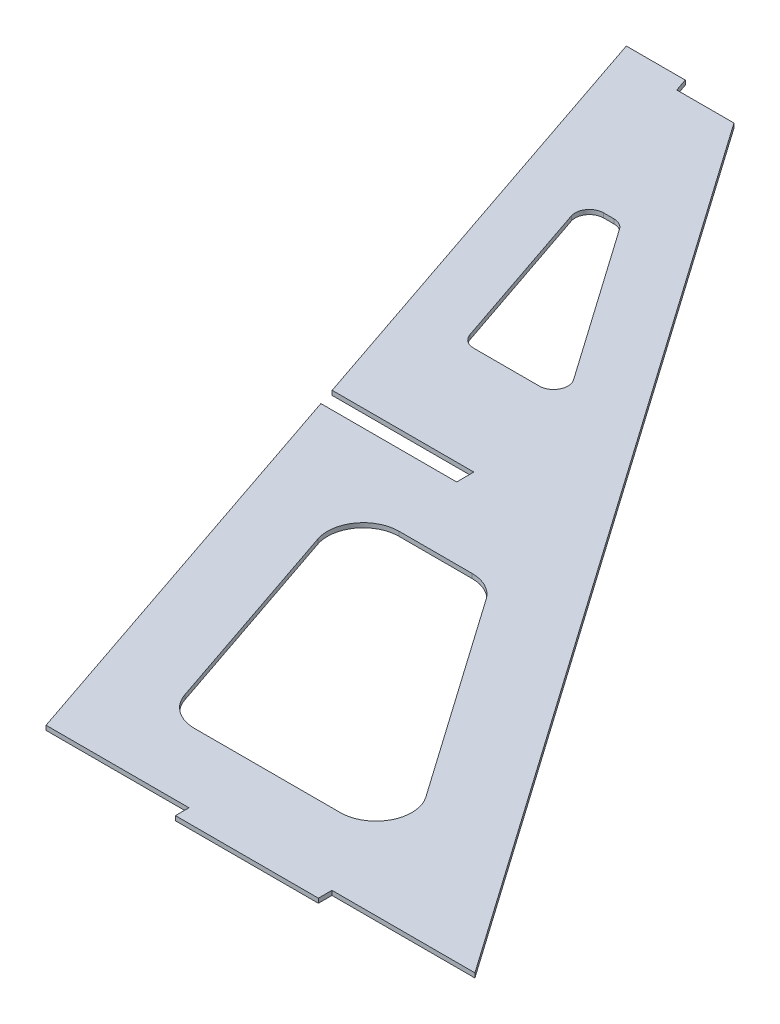
ISO-10303-21;
HEADER;
FILE_DESCRIPTION(('STEP AP214'),'2;1');
FILE_NAME('part.step','',(''),(''),'','','');
FILE_SCHEMA(('AUTOMOTIVE_DESIGN { 1 0 10303 214 1 1 1 1 }'));
ENDSEC;
DATA;
#1=APPLICATION_CONTEXT('core data for automotive mechanical design processes');
#2=APPLICATION_PROTOCOL_DEFINITION('international standard','automotive_design',2000,#1);
#3=PRODUCT_CONTEXT('',#1,'mechanical');
#4=PRODUCT('Part','Part','',(#3));
#5=PRODUCT_RELATED_PRODUCT_CATEGORY('part','',(#4));
#6=PRODUCT_DEFINITION_FORMATION('','',#4);
#7=PRODUCT_DEFINITION_CONTEXT('part definition',#1,'design');
#8=PRODUCT_DEFINITION('design','',#6,#7);
#9=PRODUCT_DEFINITION_SHAPE('','',#8);
#10=(LENGTH_UNIT() NAMED_UNIT(*) SI_UNIT(.MILLI.,.METRE.));
#11=(NAMED_UNIT(*) PLANE_ANGLE_UNIT() SI_UNIT($,.RADIAN.));
#12=(NAMED_UNIT(*) SI_UNIT($,.STERADIAN.) SOLID_ANGLE_UNIT());
#13=UNCERTAINTY_MEASURE_WITH_UNIT(LENGTH_MEASURE(1.E-05),#10,'distance_accuracy_value','');
#14=(GEOMETRIC_REPRESENTATION_CONTEXT(3) GLOBAL_UNCERTAINTY_ASSIGNED_CONTEXT((#13)) GLOBAL_UNIT_ASSIGNED_CONTEXT((#10,
#11,#12)) REPRESENTATION_CONTEXT('',''));
#15=CARTESIAN_POINT('',(0.,0.,0.));
#16=DIRECTION('',(0.,0.,1.));
#17=DIRECTION('',(1.,0.,0.));
#18=AXIS2_PLACEMENT_3D('',#15,#16,#17);
#19=CARTESIAN_POINT('',(-101.6,1.5875,-4.82599999999999));
#20=DIRECTION('',(0.946947902183429,0.,-0.321387103895603));
#21=DIRECTION('',(-0.321387103895603,0.,-0.946947902183429));
#22=AXIS2_PLACEMENT_3D('',#19,#20,#21);
#23=PLANE('',#22);
#24=DIRECTION('',(0.321387103895603,0.,0.946947902183429));
#25=VECTOR('',#24,1.);
#26=CARTESIAN_POINT('',(-101.6,1.5875,-4.82599999999999));
#27=LINE('',#26,#25);
#28=CARTESIAN_POINT('',(-151.771728228272,1.5875,-152.654));
#29=VERTEX_POINT('',#28);
#30=CARTESIAN_POINT('',(-101.6,1.5875,-4.82599999999999));
#31=VERTEX_POINT('',#30);
#32=EDGE_CURVE('E277',#29,#31,#27,.T.);
#33=ORIENTED_EDGE('',*,*,#32,.F.);
#34=DIRECTION('',(0.,1.,0.));
#35=VECTOR('',#34,1.);
#36=CARTESIAN_POINT('',(-151.771728228272,0.,-152.654));
#37=LINE('',#36,#35);
#38=CARTESIAN_POINT('',(-151.771728228272,0.,-152.654));
#39=VERTEX_POINT('',#38);
#40=EDGE_CURVE('E267',#39,#29,#37,.T.);
#41=ORIENTED_EDGE('',*,*,#40,.F.);
#42=DIRECTION('',(0.321387103895603,0.,0.946947902183429));
#43=VECTOR('',#42,1.);
#44=CARTESIAN_POINT('',(-101.6,0.,-4.82599999999999));
#45=LINE('',#44,#43);
#46=CARTESIAN_POINT('',(-101.6,0.,-4.82599999999999));
#47=VERTEX_POINT('',#46);
#48=EDGE_CURVE('E254',#39,#47,#45,.T.);
#49=ORIENTED_EDGE('',*,*,#48,.T.);
#50=DIRECTION('',(0.,-1.,0.));
#51=VECTOR('',#50,1.);
#52=CARTESIAN_POINT('',(-101.6,1.5875,-4.82599999999999));
#53=LINE('',#52,#51);
#54=EDGE_CURVE('E343',#31,#47,#53,.T.);
#55=ORIENTED_EDGE('',*,*,#54,.F.);
#56=EDGE_LOOP('',(#33,#41,#49,#55));
#57=FACE_BOUND('',#56,.T.);
#58=ADVANCED_FACE('F33',(#57),#23,.F.);
#59=CARTESIAN_POINT('',(-207.536668490646,0.,-316.962065123836));
#60=VERTEX_POINT('',#59);
#61=CARTESIAN_POINT('',(-153.840665474799,0.,-158.75));
#62=VERTEX_POINT('',#61);
#63=EDGE_CURVE('E296',#60,#62,#45,.T.);
#64=ORIENTED_EDGE('',*,*,#63,.T.);
#65=DIRECTION('',(0.,1.,0.));
#66=VECTOR('',#65,1.);
#67=CARTESIAN_POINT('',(-153.840665474799,0.,-158.75));
#68=LINE('',#67,#66);
#69=CARTESIAN_POINT('',(-153.840665474799,1.5875,-158.75));
#70=VERTEX_POINT('',#69);
#71=EDGE_CURVE('E269',#62,#70,#68,.T.);
#72=ORIENTED_EDGE('',*,*,#71,.T.);
#73=CARTESIAN_POINT('',(-207.536668490646,1.5875,-316.962065123836));
#74=VERTEX_POINT('',#73);
#75=EDGE_CURVE('E273',#74,#70,#27,.T.);
#76=ORIENTED_EDGE('',*,*,#75,.F.);
#77=DIRECTION('',(0.,-1.,0.));
#78=VECTOR('',#77,1.);
#79=CARTESIAN_POINT('',(-207.536668490646,1.5875,-316.962065123836));
#80=LINE('',#79,#78);
#81=EDGE_CURVE('E295',#74,#60,#80,.T.);
#82=ORIENTED_EDGE('',*,*,#81,.T.);
#83=EDGE_LOOP('',(#64,#72,#76,#82));
#84=FACE_BOUND('',#83,.T.);
#85=ADVANCED_FACE('F467',(#84),#23,.F.);
#86=CARTESIAN_POINT('',(-50.8,1.5875,-4.82599999999999));
#87=DIRECTION('',(0.,0.,-1.));
#88=DIRECTION('',(-1.,0.,0.));
#89=AXIS2_PLACEMENT_3D('',#86,#87,#88);
#90=PLANE('',#89);
#91=DIRECTION('',(1.,0.,0.));
#92=VECTOR('',#91,1.);
#93=CARTESIAN_POINT('',(-50.8,0.,-4.82599999999999));
#94=LINE('',#93,#92);
#95=CARTESIAN_POINT('',(-50.8,0.,-4.82599999999999));
#96=VERTEX_POINT('',#95);
#97=EDGE_CURVE('E299',#47,#96,#94,.T.);
#98=ORIENTED_EDGE('',*,*,#97,.T.);
#99=DIRECTION('',(0.,-1.,0.));
#100=VECTOR('',#99,1.);
#101=CARTESIAN_POINT('',(-50.8,1.5875,-4.82599999999999));
#102=LINE('',#101,#100);
#103=CARTESIAN_POINT('',(-50.8,1.5875,-4.82599999999999));
#104=VERTEX_POINT('',#103);
#105=EDGE_CURVE('E340',#104,#96,#102,.T.);
#106=ORIENTED_EDGE('',*,*,#105,.F.);
#107=DIRECTION('',(1.,0.,0.));
#108=VECTOR('',#107,1.);
#109=CARTESIAN_POINT('',(-50.8,1.5875,-4.82599999999999));
#110=LINE('',#109,#108);
#111=EDGE_CURVE('E276',#31,#104,#110,.T.);
#112=ORIENTED_EDGE('',*,*,#111,.F.);
#113=ORIENTED_EDGE('',*,*,#54,.T.);
#114=EDGE_LOOP('',(#98,#106,#112,#113));
#115=FACE_BOUND('',#114,.T.);
#116=ADVANCED_FACE('F473',(#115),#90,.F.);
#117=CARTESIAN_POINT('',(-50.8,1.5875,0.));
#118=DIRECTION('',(1.,0.,0.));
#119=DIRECTION('',(0.,0.,-1.));
#120=AXIS2_PLACEMENT_3D('',#117,#118,#119);
#121=PLANE('',#120);
#122=DIRECTION('',(0.,0.,1.));
#123=VECTOR('',#122,1.);
#124=CARTESIAN_POINT('',(-50.8,0.,0.));
#125=LINE('',#124,#123);
#126=CARTESIAN_POINT('',(-50.8,0.,0.));
#127=VERTEX_POINT('',#126);
#128=EDGE_CURVE('E301',#96,#127,#125,.T.);
#129=ORIENTED_EDGE('',*,*,#128,.T.);
#130=DIRECTION('',(0.,-1.,0.));
#131=VECTOR('',#130,1.);
#132=CARTESIAN_POINT('',(-50.8,1.5875,0.));
#133=LINE('',#132,#131);
#134=CARTESIAN_POINT('',(-50.8,1.5875,0.));
#135=VERTEX_POINT('',#134);
#136=EDGE_CURVE('E337',#135,#127,#133,.T.);
#137=ORIENTED_EDGE('',*,*,#136,.F.);
#138=DIRECTION('',(0.,0.,1.));
#139=VECTOR('',#138,1.);
#140=CARTESIAN_POINT('',(-50.8,1.5875,0.));
#141=LINE('',#140,#139);
#142=EDGE_CURVE('E279',#104,#135,#141,.T.);
#143=ORIENTED_EDGE('',*,*,#142,.F.);
#144=ORIENTED_EDGE('',*,*,#105,.T.);
#145=EDGE_LOOP('',(#129,#137,#143,#144));
#146=FACE_BOUND('',#145,.T.);
#147=ADVANCED_FACE('F557',(#146),#121,.F.);
#148=CARTESIAN_POINT('',(0.,1.5875,0.));
#149=DIRECTION('',(0.,0.,-1.));
#150=DIRECTION('',(-1.,0.,0.));
#151=AXIS2_PLACEMENT_3D('',#148,#149,#150);
#152=PLANE('',#151);
#153=DIRECTION('',(1.,0.,0.));
#154=VECTOR('',#153,1.);
#155=CARTESIAN_POINT('',(0.,0.,0.));
#156=LINE('',#155,#154);
#157=CARTESIAN_POINT('',(0.,0.,0.));
#158=VERTEX_POINT('',#157);
#159=EDGE_CURVE('E303',#127,#158,#156,.T.);
#160=ORIENTED_EDGE('',*,*,#159,.T.);
#161=DIRECTION('',(0.,-1.,0.));
#162=VECTOR('',#161,1.);
#163=CARTESIAN_POINT('',(0.,1.5875,0.));
#164=LINE('',#163,#162);
#165=CARTESIAN_POINT('',(0.,1.5875,0.));
#166=VERTEX_POINT('',#165);
#167=EDGE_CURVE('E334',#166,#158,#164,.T.);
#168=ORIENTED_EDGE('',*,*,#167,.F.);
#169=DIRECTION('',(1.,0.,0.));
#170=VECTOR('',#169,1.);
#171=CARTESIAN_POINT('',(0.,1.5875,0.));
#172=LINE('',#171,#170);
#173=EDGE_CURVE('E281',#135,#166,#172,.T.);
#174=ORIENTED_EDGE('',*,*,#173,.F.);
#175=ORIENTED_EDGE('',*,*,#136,.T.);
#176=EDGE_LOOP('',(#160,#168,#174,#175));
#177=FACE_BOUND('',#176,.T.);
#178=ADVANCED_FACE('F554',(#177),#152,.F.);
#179=CARTESIAN_POINT('',(0.,1.5875,-4.826));
#180=DIRECTION('',(-1.,0.,0.));
#181=DIRECTION('',(0.,0.,1.));
#182=AXIS2_PLACEMENT_3D('',#179,#180,#181);
#183=PLANE('',#182);
#184=DIRECTION('',(0.,0.,-1.));
#185=VECTOR('',#184,1.);
#186=CARTESIAN_POINT('',(0.,0.,-4.826));
#187=LINE('',#186,#185);
#188=CARTESIAN_POINT('',(0.,0.,-4.826));
#189=VERTEX_POINT('',#188);
#190=EDGE_CURVE('E305',#158,#189,#187,.T.);
#191=ORIENTED_EDGE('',*,*,#190,.T.);
#192=DIRECTION('',(0.,-1.,0.));
#193=VECTOR('',#192,1.);
#194=CARTESIAN_POINT('',(0.,1.5875,-4.826));
#195=LINE('',#194,#193);
#196=CARTESIAN_POINT('',(0.,1.5875,-4.826));
#197=VERTEX_POINT('',#196);
#198=EDGE_CURVE('E331',#197,#189,#195,.T.);
#199=ORIENTED_EDGE('',*,*,#198,.F.);
#200=DIRECTION('',(0.,0.,-1.));
#201=VECTOR('',#200,1.);
#202=CARTESIAN_POINT('',(0.,1.5875,-4.826));
#203=LINE('',#202,#201);
#204=EDGE_CURVE('E283',#166,#197,#203,.T.);
#205=ORIENTED_EDGE('',*,*,#204,.F.);
#206=ORIENTED_EDGE('',*,*,#167,.T.);
#207=EDGE_LOOP('',(#191,#199,#205,#206));
#208=FACE_BOUND('',#207,.T.);
#209=ADVANCED_FACE('F550',(#208),#183,.F.);
#210=CARTESIAN_POINT('',(50.8,1.5875,-4.82600000000001));
#211=DIRECTION('',(0.,0.,-1.));
#212=DIRECTION('',(-1.,0.,0.));
#213=AXIS2_PLACEMENT_3D('',#210,#211,#212);
#214=PLANE('',#213);
#215=DIRECTION('',(1.,0.,0.));
#216=VECTOR('',#215,1.);
#217=CARTESIAN_POINT('',(50.8,0.,-4.82600000000001));
#218=LINE('',#217,#216);
#219=CARTESIAN_POINT('',(50.8,0.,-4.82600000000001));
#220=VERTEX_POINT('',#219);
#221=EDGE_CURVE('E307',#189,#220,#218,.T.);
#222=ORIENTED_EDGE('',*,*,#221,.T.);
#223=DIRECTION('',(0.,-1.,0.));
#224=VECTOR('',#223,1.);
#225=CARTESIAN_POINT('',(50.8,1.5875,-4.82600000000001));
#226=LINE('',#225,#224);
#227=CARTESIAN_POINT('',(50.8,1.5875,-4.82600000000001));
#228=VERTEX_POINT('',#227);
#229=EDGE_CURVE('E328',#228,#220,#226,.T.);
#230=ORIENTED_EDGE('',*,*,#229,.F.);
#231=DIRECTION('',(1.,0.,0.));
#232=VECTOR('',#231,1.);
#233=CARTESIAN_POINT('',(50.8,1.5875,-4.82600000000001));
#234=LINE('',#233,#232);
#235=EDGE_CURVE('E285',#197,#228,#234,.T.);
#236=ORIENTED_EDGE('',*,*,#235,.F.);
#237=ORIENTED_EDGE('',*,*,#198,.T.);
#238=EDGE_LOOP('',(#222,#230,#236,#237));
#239=FACE_BOUND('',#238,.T.);
#240=ADVANCED_FACE('F546',(#239),#214,.F.);
#241=CARTESIAN_POINT('',(-164.710654327246,1.5875,-312.392094547898));
#242=DIRECTION('',(-0.818963643328424,0.,0.573845406800676));
#243=DIRECTION('',(0.573845406800676,0.,0.818963643328424));
#244=AXIS2_PLACEMENT_3D('',#241,#242,#243);
#245=PLANE('',#244);
#246=DIRECTION('',(-0.573845406800676,0.,-0.818963643328424));
#247=VECTOR('',#246,1.);
#248=CARTESIAN_POINT('',(-164.710654327246,0.,-312.392094547898));
#249=LINE('',#248,#247);
#250=CARTESIAN_POINT('',(-164.710654327246,0.,-312.392094547898));
#251=VERTEX_POINT('',#250);
#252=EDGE_CURVE('E309',#220,#251,#249,.T.);
#253=ORIENTED_EDGE('',*,*,#252,.T.);
#254=DIRECTION('',(0.,-1.,0.));
#255=VECTOR('',#254,1.);
#256=CARTESIAN_POINT('',(-164.710654327246,1.5875,-312.392094547898));
#257=LINE('',#256,#255);
#258=CARTESIAN_POINT('',(-164.710654327246,1.5875,-312.392094547898));
#259=VERTEX_POINT('',#258);
#260=EDGE_CURVE('E325',#259,#251,#257,.T.);
#261=ORIENTED_EDGE('',*,*,#260,.F.);
#262=DIRECTION('',(-0.573845406800676,0.,-0.818963643328424));
#263=VECTOR('',#262,1.);
#264=CARTESIAN_POINT('',(-164.710654327246,1.5875,-312.392094547898));
#265=LINE('',#264,#263);
#266=EDGE_CURVE('E287',#228,#259,#265,.T.);
#267=ORIENTED_EDGE('',*,*,#266,.F.);
#268=ORIENTED_EDGE('',*,*,#229,.T.);
#269=EDGE_LOOP('',(#253,#261,#267,#268));
#270=FACE_BOUND('',#269,.T.);
#271=ADVANCED_FACE('F542',(#270),#245,.F.);
#272=CARTESIAN_POINT('',(-185.030654327246,1.5875,-312.392094547898));
#273=DIRECTION('',(0.,0.,1.));
#274=DIRECTION('',(1.,0.,0.));
#275=AXIS2_PLACEMENT_3D('',#272,#273,#274);
#276=PLANE('',#275);
#277=DIRECTION('',(-1.,0.,0.));
#278=VECTOR('',#277,1.);
#279=CARTESIAN_POINT('',(-185.030654327246,0.,-312.392094547898));
#280=LINE('',#279,#278);
#281=CARTESIAN_POINT('',(-185.030654327246,0.,-312.392094547898));
#282=VERTEX_POINT('',#281);
#283=EDGE_CURVE('E311',#251,#282,#280,.T.);
#284=ORIENTED_EDGE('',*,*,#283,.T.);
#285=DIRECTION('',(0.,-1.,0.));
#286=VECTOR('',#285,1.);
#287=CARTESIAN_POINT('',(-185.030654327246,1.5875,-312.392094547898));
#288=LINE('',#287,#286);
#289=CARTESIAN_POINT('',(-185.030654327246,1.5875,-312.392094547898));
#290=VERTEX_POINT('',#289);
#291=EDGE_CURVE('E322',#290,#282,#288,.T.);
#292=ORIENTED_EDGE('',*,*,#291,.F.);
#293=DIRECTION('',(-1.,0.,0.));
#294=VECTOR('',#293,1.);
#295=CARTESIAN_POINT('',(-185.030654327246,1.5875,-312.392094547898));
#296=LINE('',#295,#294);
#297=EDGE_CURVE('E289',#259,#290,#296,.T.);
#298=ORIENTED_EDGE('',*,*,#297,.F.);
#299=ORIENTED_EDGE('',*,*,#260,.T.);
#300=EDGE_LOOP('',(#284,#292,#298,#299));
#301=FACE_BOUND('',#300,.T.);
#302=ADVANCED_FACE('F538',(#301),#276,.F.);
#303=CARTESIAN_POINT('',(-186.581668490646,1.5875,-316.962065123835));
#304=DIRECTION('',(-0.946947902183429,0.,0.321387103895602));
#305=DIRECTION('',(0.321387103895602,0.,0.946947902183429));
#306=AXIS2_PLACEMENT_3D('',#303,#304,#305);
#307=PLANE('',#306);
#308=DIRECTION('',(-0.321387103895602,0.,-0.946947902183429));
#309=VECTOR('',#308,1.);
#310=CARTESIAN_POINT('',(-186.581668490646,0.,-316.962065123835));
#311=LINE('',#310,#309);
#312=CARTESIAN_POINT('',(-186.581668490646,0.,-316.962065123835));
#313=VERTEX_POINT('',#312);
#314=EDGE_CURVE('E313',#282,#313,#311,.T.);
#315=ORIENTED_EDGE('',*,*,#314,.T.);
#316=DIRECTION('',(0.,-1.,0.));
#317=VECTOR('',#316,1.);
#318=CARTESIAN_POINT('',(-186.581668490646,1.5875,-316.962065123835));
#319=LINE('',#318,#317);
#320=CARTESIAN_POINT('',(-186.581668490646,1.5875,-316.962065123835));
#321=VERTEX_POINT('',#320);
#322=EDGE_CURVE('E319',#321,#313,#319,.T.);
#323=ORIENTED_EDGE('',*,*,#322,.F.);
#324=DIRECTION('',(-0.321387103895602,0.,-0.946947902183429));
#325=VECTOR('',#324,1.);
#326=CARTESIAN_POINT('',(-186.581668490646,1.5875,-316.962065123835));
#327=LINE('',#326,#325);
#328=EDGE_CURVE('E291',#290,#321,#327,.T.);
#329=ORIENTED_EDGE('',*,*,#328,.F.);
#330=ORIENTED_EDGE('',*,*,#291,.T.);
#331=EDGE_LOOP('',(#315,#323,#329,#330));
#332=FACE_BOUND('',#331,.T.);
#333=ADVANCED_FACE('F534',(#332),#307,.F.);
#334=CARTESIAN_POINT('',(-207.536668490646,1.5875,-316.962065123836));
#335=DIRECTION('',(0.,0.,1.));
#336=DIRECTION('',(1.,0.,0.));
#337=AXIS2_PLACEMENT_3D('',#334,#335,#336);
#338=PLANE('',#337);
#339=DIRECTION('',(-1.,0.,0.));
#340=VECTOR('',#339,1.);
#341=CARTESIAN_POINT('',(-207.536668490646,0.,-316.962065123836));
#342=LINE('',#341,#340);
#343=EDGE_CURVE('E315',#313,#60,#342,.T.);
#344=ORIENTED_EDGE('',*,*,#343,.T.);
#345=ORIENTED_EDGE('',*,*,#81,.F.);
#346=DIRECTION('',(-1.,0.,0.));
#347=VECTOR('',#346,1.);
#348=CARTESIAN_POINT('',(-207.536668490646,1.5875,-316.962065123836));
#349=LINE('',#348,#347);
#350=EDGE_CURVE('E293',#321,#74,#349,.T.);
#351=ORIENTED_EDGE('',*,*,#350,.F.);
#352=ORIENTED_EDGE('',*,*,#322,.T.);
#353=EDGE_LOOP('',(#344,#345,#351,#352));
#354=FACE_BOUND('',#353,.T.);
#355=ADVANCED_FACE('F527',(#354),#338,.F.);
#356=CARTESIAN_POINT('',(0.,1.5875,0.));
#357=DIRECTION('',(0.,-1.,0.));
#358=DIRECTION('',(0.,0.,-1.));
#359=AXIS2_PLACEMENT_3D('',#356,#357,#358);
#360=PLANE('',#359);
#361=DIRECTION('',(0.321387103895603,0.,0.946947902183429));
#362=VECTOR('',#361,1.);
#363=CARTESIAN_POINT('',(-116.328139028106,1.5875,-127.254));
#364=LINE('',#363,#362);
#365=CARTESIAN_POINT('',(-110.632582785753,1.5875,-110.472383780526));
#366=VERTEX_POINT('',#365);
#367=CARTESIAN_POINT('',(-86.3225701390642,1.5875,-38.8443837805258));
#368=VERTEX_POINT('',#367);
#369=EDGE_CURVE('E792',#366,#368,#364,.T.);
#370=ORIENTED_EDGE('',*,*,#369,.F.);
#371=CARTESIAN_POINT('',(-98.606344428023,1.5875,-114.554));
#372=DIRECTION('',(0.,-1.,0.));
#373=DIRECTION('',(0.,0.,-1.));
#374=AXIS2_PLACEMENT_3D('',#371,#372,#373);
#375=CIRCLE('',#374,12.7);
#376=CARTESIAN_POINT('',(-98.606344428023,1.5875,-127.254));
#377=VERTEX_POINT('',#376);
#378=EDGE_CURVE('E378',#366,#377,#375,.T.);
#379=ORIENTED_EDGE('',*,*,#378,.T.);
#380=DIRECTION('',(-1.,0.,0.));
#381=VECTOR('',#380,1.);
#382=CARTESIAN_POINT('',(-65.9997459264909,1.5875,-127.254));
#383=LINE('',#382,#381);
#384=CARTESIAN_POINT('',(-72.6082973288894,1.5875,-127.254));
#385=VERTEX_POINT('',#384);
#386=EDGE_CURVE('E441',#385,#377,#383,.T.);
#387=ORIENTED_EDGE('',*,*,#386,.F.);
#388=CARTESIAN_POINT('',(-72.6082973288894,1.5875,-114.554));
#389=DIRECTION('',(0.,-1.,0.));
#390=DIRECTION('',(0.,0.,-1.));
#391=AXIS2_PLACEMENT_3D('',#388,#389,#390);
#392=CIRCLE('',#391,12.7);
#393=CARTESIAN_POINT('',(-62.2074590586184,1.5875,-121.841836666369));
#394=VERTEX_POINT('',#393);
#395=EDGE_CURVE('E374',#385,#394,#392,.T.);
#396=ORIENTED_EDGE('',*,*,#395,.T.);
#397=DIRECTION('',(-0.573845406800677,0.,-0.818963643328424));
#398=VECTOR('',#397,1.);
#399=CARTESIAN_POINT('',(1.98748718774812,1.5875,-30.226));
#400=LINE('',#399,#398);
#401=CARTESIAN_POINT('',(-12.0179309481068,1.5875,-50.2138366663686));
#402=VERTEX_POINT('',#401);
#403=EDGE_CURVE('E818',#402,#394,#400,.T.);
#404=ORIENTED_EDGE('',*,*,#403,.F.);
#405=CARTESIAN_POINT('',(-22.4187692183778,1.5875,-42.926));
#406=DIRECTION('',(0.,-1.,0.));
#407=DIRECTION('',(0.,0.,-1.));
#408=AXIS2_PLACEMENT_3D('',#405,#406,#407);
#409=CIRCLE('',#408,12.7);
#410=CARTESIAN_POINT('',(-22.4187692183778,1.5875,-30.226));
#411=VERTEX_POINT('',#410);
#412=EDGE_CURVE('E366',#402,#411,#409,.T.);
#413=ORIENTED_EDGE('',*,*,#412,.T.);
#414=DIRECTION('',(1.,0.,0.));
#415=VECTOR('',#414,1.);
#416=CARTESIAN_POINT('',(-83.3975545208897,1.5875,-30.226));
#417=LINE('',#416,#415);
#418=CARTESIAN_POINT('',(-74.2963317813346,1.5875,-30.226));
#419=VERTEX_POINT('',#418);
#420=EDGE_CURVE('E797',#419,#411,#417,.T.);
#421=ORIENTED_EDGE('',*,*,#420,.F.);
#422=CARTESIAN_POINT('',(-74.2963317813346,1.5875,-42.926));
#423=DIRECTION('',(0.,-1.,0.));
#424=DIRECTION('',(0.,0.,-1.));
#425=AXIS2_PLACEMENT_3D('',#422,#423,#424);
#426=CIRCLE('',#425,12.7);
#427=EDGE_CURVE('E370',#419,#368,#426,.T.);
#428=ORIENTED_EDGE('',*,*,#427,.T.);
#429=EDGE_LOOP('',(#370,#379,#387,#396,#404,#413,#421,#428));
#430=FACE_BOUND('',#429,.T.);
#431=DIRECTION('',(0.321387103895603,0.,0.946947902183429));
#432=VECTOR('',#431,1.);
#433=CARTESIAN_POINT('',(-167.28609673448,1.5875,-261.592094547898));
#434=LINE('',#433,#432);
#435=CARTESIAN_POINT('',(-165.007874237539,1.5875,-254.879448060109));
#436=VERTEX_POINT('',#435);
#437=CARTESIAN_POINT('',(-146.48311564115,1.5875,-200.29735351221));
#438=VERTEX_POINT('',#437);
#439=EDGE_CURVE('E418',#436,#438,#434,.T.);
#440=ORIENTED_EDGE('',*,*,#439,.F.);
#441=CARTESIAN_POINT('',(-160.197378894447,1.5875,-256.512094547898));
#442=DIRECTION('',(0.,-1.,0.));
#443=DIRECTION('',(0.,0.,-1.));
#444=AXIS2_PLACEMENT_3D('',#441,#442,#443);
#445=CIRCLE('',#444,5.08);
#446=CARTESIAN_POINT('',(-160.197378894447,1.5875,-261.592094547898));
#447=VERTEX_POINT('',#446);
#448=EDGE_CURVE('E41',#436,#447,#445,.T.);
#449=ORIENTED_EDGE('',*,*,#448,.T.);
#450=DIRECTION('',(-1.,0.,0.));
#451=VECTOR('',#450,1.);
#452=CARTESIAN_POINT('',(-153.927090566611,1.5875,-261.592094547898));
#453=LINE('',#452,#451);
#454=CARTESIAN_POINT('',(-156.57051112757,1.5875,-261.592094547898));
#455=VERTEX_POINT('',#454);
#456=EDGE_CURVE('E416',#455,#447,#453,.T.);
#457=ORIENTED_EDGE('',*,*,#456,.F.);
#458=CARTESIAN_POINT('',(-156.57051112757,1.5875,-256.512094547898));
#459=DIRECTION('',(0.,-1.,0.));
#460=DIRECTION('',(0.,0.,-1.));
#461=AXIS2_PLACEMENT_3D('',#458,#459,#460);
#462=CIRCLE('',#461,5.08);
#463=CARTESIAN_POINT('',(-152.410175819462,1.5875,-259.427229214446));
#464=VERTEX_POINT('',#463);
#465=EDGE_CURVE('E409',#455,#464,#462,.T.);
#466=ORIENTED_EDGE('',*,*,#465,.T.);
#467=DIRECTION('',(-0.573845406800676,0.,-0.818963643328424));
#468=VECTOR('',#467,1.);
#469=CARTESIAN_POINT('',(-108.562496074999,1.5875,-196.85));
#470=LINE('',#469,#468);
#471=CARTESIAN_POINT('',(-114.164663329341,1.5875,-204.845134666547));
#472=VERTEX_POINT('',#471);
#473=EDGE_CURVE('E260',#472,#464,#470,.T.);
#474=ORIENTED_EDGE('',*,*,#473,.F.);
#475=CARTESIAN_POINT('',(-118.32499863745,1.5875,-201.93));
#476=DIRECTION('',(0.,-1.,0.));
#477=DIRECTION('',(0.,0.,-1.));
#478=AXIS2_PLACEMENT_3D('',#475,#476,#477);
#479=CIRCLE('',#478,5.08);
#480=CARTESIAN_POINT('',(-118.32499863745,1.5875,-196.85));
#481=VERTEX_POINT('',#480);
#482=EDGE_CURVE('E401',#472,#481,#479,.T.);
#483=ORIENTED_EDGE('',*,*,#482,.T.);
#484=DIRECTION('',(1.,0.,0.));
#485=VECTOR('',#484,1.);
#486=CARTESIAN_POINT('',(-145.31310939388,1.5875,-196.85));
#487=LINE('',#486,#485);
#488=CARTESIAN_POINT('',(-141.672620298058,1.5875,-196.85));
#489=VERTEX_POINT('',#488);
#490=EDGE_CURVE('E443',#489,#481,#487,.T.);
#491=ORIENTED_EDGE('',*,*,#490,.F.);
#492=CARTESIAN_POINT('',(-141.672620298058,1.5875,-201.93));
#493=DIRECTION('',(0.,-1.,0.));
#494=DIRECTION('',(0.,0.,-1.));
#495=AXIS2_PLACEMENT_3D('',#492,#493,#494);
#496=CIRCLE('',#495,5.08);
#497=EDGE_CURVE('E405',#489,#438,#496,.T.);
#498=ORIENTED_EDGE('',*,*,#497,.T.);
#499=EDGE_LOOP('',(#440,#449,#457,#466,#474,#483,#491,#498));
#500=FACE_BOUND('',#499,.T.);
#501=DIRECTION('',(0.,0.,-1.));
#502=VECTOR('',#501,1.);
#503=CARTESIAN_POINT('',(-103.511728228272,1.5875,-158.75));
#504=LINE('',#503,#502);
#505=CARTESIAN_POINT('',(-103.511728228272,1.5875,-152.654));
#506=VERTEX_POINT('',#505);
#507=CARTESIAN_POINT('',(-103.511728228272,1.5875,-158.75));
#508=VERTEX_POINT('',#507);
#509=EDGE_CURVE('E257',#506,#508,#504,.T.);
#510=ORIENTED_EDGE('',*,*,#509,.F.);
#511=DIRECTION('',(1.,0.,0.));
#512=VECTOR('',#511,1.);
#513=CARTESIAN_POINT('',(-103.511728228272,1.5875,-152.654));
#514=LINE('',#513,#512);
#515=EDGE_CURVE('E237',#29,#506,#514,.T.);
#516=ORIENTED_EDGE('',*,*,#515,.F.);
#517=ORIENTED_EDGE('',*,*,#32,.T.);
#518=ORIENTED_EDGE('',*,*,#111,.T.);
#519=ORIENTED_EDGE('',*,*,#142,.T.);
#520=ORIENTED_EDGE('',*,*,#173,.T.);
#521=ORIENTED_EDGE('',*,*,#204,.T.);
#522=ORIENTED_EDGE('',*,*,#235,.T.);
#523=ORIENTED_EDGE('',*,*,#266,.T.);
#524=ORIENTED_EDGE('',*,*,#297,.T.);
#525=ORIENTED_EDGE('',*,*,#328,.T.);
#526=ORIENTED_EDGE('',*,*,#350,.T.);
#527=ORIENTED_EDGE('',*,*,#75,.T.);
#528=DIRECTION('',(-1.,0.,0.));
#529=VECTOR('',#528,1.);
#530=CARTESIAN_POINT('',(-153.840665474799,1.5875,-158.75));
#531=LINE('',#530,#529);
#532=EDGE_CURVE('E255',#508,#70,#531,.T.);
#533=ORIENTED_EDGE('',*,*,#532,.F.);
#534=EDGE_LOOP('',(#510,#516,#517,#518,#519,#520,#521,#522,#523,#524,#525,#526,#527,#533));
#535=FACE_BOUND('',#534,.T.);
#536=ADVANCED_FACE('F414',(#430,#500,#535),#360,.F.);
#537=CARTESIAN_POINT('',(0.,0.,0.));
#538=DIRECTION('',(0.,-1.,0.));
#539=DIRECTION('',(0.,0.,-1.));
#540=AXIS2_PLACEMENT_3D('',#537,#538,#539);
#541=PLANE('',#540);
#542=DIRECTION('',(-0.573845406800677,0.,-0.818963643328424));
#543=VECTOR('',#542,1.);
#544=CARTESIAN_POINT('',(1.98748718774812,0.,-30.226));
#545=LINE('',#544,#543);
#546=CARTESIAN_POINT('',(-12.0179309481068,0.,-50.2138366663686));
#547=VERTEX_POINT('',#546);
#548=CARTESIAN_POINT('',(-62.2074590586184,0.,-121.841836666369));
#549=VERTEX_POINT('',#548);
#550=EDGE_CURVE('E265',#547,#549,#545,.T.);
#551=ORIENTED_EDGE('',*,*,#550,.T.);
#552=CARTESIAN_POINT('',(-72.6082973288894,0.,-114.554));
#553=DIRECTION('',(0.,-1.,0.));
#554=DIRECTION('',(0.,0.,-1.));
#555=AXIS2_PLACEMENT_3D('',#552,#553,#554);
#556=CIRCLE('',#555,12.7);
#557=CARTESIAN_POINT('',(-72.6082973288894,0.,-127.254));
#558=VERTEX_POINT('',#557);
#559=EDGE_CURVE('E376',#549,#558,#556,.F.);
#560=ORIENTED_EDGE('',*,*,#559,.T.);
#561=DIRECTION('',(-1.,0.,0.));
#562=VECTOR('',#561,1.);
#563=CARTESIAN_POINT('',(-65.9997459264909,0.,-127.254));
#564=LINE('',#563,#562);
#565=CARTESIAN_POINT('',(-98.606344428023,0.,-127.254));
#566=VERTEX_POINT('',#565);
#567=EDGE_CURVE('E812',#558,#566,#564,.T.);
#568=ORIENTED_EDGE('',*,*,#567,.T.);
#569=CARTESIAN_POINT('',(-98.606344428023,0.,-114.554));
#570=DIRECTION('',(0.,-1.,0.));
#571=DIRECTION('',(0.,0.,-1.));
#572=AXIS2_PLACEMENT_3D('',#569,#570,#571);
#573=CIRCLE('',#572,12.7);
#574=CARTESIAN_POINT('',(-110.632582785753,0.,-110.472383780526));
#575=VERTEX_POINT('',#574);
#576=EDGE_CURVE('E380',#566,#575,#573,.F.);
#577=ORIENTED_EDGE('',*,*,#576,.T.);
#578=DIRECTION('',(0.321387103895603,0.,0.946947902183429));
#579=VECTOR('',#578,1.);
#580=CARTESIAN_POINT('',(-116.328139028106,0.,-127.254));
#581=LINE('',#580,#579);
#582=CARTESIAN_POINT('',(-86.3225701390642,0.,-38.8443837805258));
#583=VERTEX_POINT('',#582);
#584=EDGE_CURVE('E806',#575,#583,#581,.T.);
#585=ORIENTED_EDGE('',*,*,#584,.T.);
#586=CARTESIAN_POINT('',(-74.2963317813346,0.,-42.926));
#587=DIRECTION('',(0.,-1.,0.));
#588=DIRECTION('',(0.,0.,-1.));
#589=AXIS2_PLACEMENT_3D('',#586,#587,#588);
#590=CIRCLE('',#589,12.7);
#591=CARTESIAN_POINT('',(-74.2963317813346,0.,-30.226));
#592=VERTEX_POINT('',#591);
#593=EDGE_CURVE('E372',#583,#592,#590,.F.);
#594=ORIENTED_EDGE('',*,*,#593,.T.);
#595=DIRECTION('',(1.,0.,0.));
#596=VECTOR('',#595,1.);
#597=CARTESIAN_POINT('',(-83.3975545208897,0.,-30.226));
#598=LINE('',#597,#596);
#599=CARTESIAN_POINT('',(-22.4187692183778,0.,-30.226));
#600=VERTEX_POINT('',#599);
#601=EDGE_CURVE('E804',#592,#600,#598,.T.);
#602=ORIENTED_EDGE('',*,*,#601,.T.);
#603=CARTESIAN_POINT('',(-22.4187692183778,0.,-42.926));
#604=DIRECTION('',(0.,-1.,0.));
#605=DIRECTION('',(0.,0.,-1.));
#606=AXIS2_PLACEMENT_3D('',#603,#604,#605);
#607=CIRCLE('',#606,12.7);
#608=EDGE_CURVE('E368',#600,#547,#607,.F.);
#609=ORIENTED_EDGE('',*,*,#608,.T.);
#610=EDGE_LOOP('',(#551,#560,#568,#577,#585,#594,#602,#609));
#611=FACE_BOUND('',#610,.T.);
#612=DIRECTION('',(-0.573845406800676,0.,-0.818963643328424));
#613=VECTOR('',#612,1.);
#614=CARTESIAN_POINT('',(-108.562496074999,0.,-196.85));
#615=LINE('',#614,#613);
#616=CARTESIAN_POINT('',(-114.164663329341,0.,-204.845134666547));
#617=VERTEX_POINT('',#616);
#618=CARTESIAN_POINT('',(-152.410175819462,0.,-259.427229214446));
#619=VERTEX_POINT('',#618);
#620=EDGE_CURVE('E436',#617,#619,#615,.T.);
#621=ORIENTED_EDGE('',*,*,#620,.T.);
#622=CARTESIAN_POINT('',(-156.57051112757,0.,-256.512094547898));
#623=DIRECTION('',(0.,-1.,0.));
#624=DIRECTION('',(0.,0.,-1.));
#625=AXIS2_PLACEMENT_3D('',#622,#623,#624);
#626=CIRCLE('',#625,5.08);
#627=CARTESIAN_POINT('',(-156.57051112757,0.,-261.592094547898));
#628=VERTEX_POINT('',#627);
#629=EDGE_CURVE('E55',#619,#628,#626,.F.);
#630=ORIENTED_EDGE('',*,*,#629,.T.);
#631=DIRECTION('',(-1.,0.,0.));
#632=VECTOR('',#631,1.);
#633=CARTESIAN_POINT('',(-153.927090566611,0.,-261.592094547898));
#634=LINE('',#633,#632);
#635=CARTESIAN_POINT('',(-160.197378894447,0.,-261.592094547898));
#636=VERTEX_POINT('',#635);
#637=EDGE_CURVE('E429',#628,#636,#634,.T.);
#638=ORIENTED_EDGE('',*,*,#637,.T.);
#639=CARTESIAN_POINT('',(-160.197378894447,0.,-256.512094547898));
#640=DIRECTION('',(0.,-1.,0.));
#641=DIRECTION('',(0.,0.,-1.));
#642=AXIS2_PLACEMENT_3D('',#639,#640,#641);
#643=CIRCLE('',#642,5.08);
#644=CARTESIAN_POINT('',(-165.007874237539,0.,-254.879448060109));
#645=VERTEX_POINT('',#644);
#646=EDGE_CURVE('E11',#636,#645,#643,.F.);
#647=ORIENTED_EDGE('',*,*,#646,.T.);
#648=DIRECTION('',(0.321387103895603,0.,0.946947902183429));
#649=VECTOR('',#648,1.);
#650=CARTESIAN_POINT('',(-167.28609673448,0.,-261.592094547898));
#651=LINE('',#650,#649);
#652=CARTESIAN_POINT('',(-146.48311564115,0.,-200.29735351221));
#653=VERTEX_POINT('',#652);
#654=EDGE_CURVE('E427',#645,#653,#651,.T.);
#655=ORIENTED_EDGE('',*,*,#654,.T.);
#656=CARTESIAN_POINT('',(-141.672620298058,0.,-201.93));
#657=DIRECTION('',(0.,-1.,0.));
#658=DIRECTION('',(0.,0.,-1.));
#659=AXIS2_PLACEMENT_3D('',#656,#657,#658);
#660=CIRCLE('',#659,5.08);
#661=CARTESIAN_POINT('',(-141.672620298058,0.,-196.85));
#662=VERTEX_POINT('',#661);
#663=EDGE_CURVE('E407',#653,#662,#660,.F.);
#664=ORIENTED_EDGE('',*,*,#663,.T.);
#665=DIRECTION('',(1.,0.,0.));
#666=VECTOR('',#665,1.);
#667=CARTESIAN_POINT('',(-145.31310939388,0.,-196.85));
#668=LINE('',#667,#666);
#669=CARTESIAN_POINT('',(-118.32499863745,0.,-196.85));
#670=VERTEX_POINT('',#669);
#671=EDGE_CURVE('E433',#662,#670,#668,.T.);
#672=ORIENTED_EDGE('',*,*,#671,.T.);
#673=CARTESIAN_POINT('',(-118.32499863745,0.,-201.93));
#674=DIRECTION('',(0.,-1.,0.));
#675=DIRECTION('',(0.,0.,-1.));
#676=AXIS2_PLACEMENT_3D('',#673,#674,#675);
#677=CIRCLE('',#676,5.08);
#678=EDGE_CURVE('E403',#670,#617,#677,.F.);
#679=ORIENTED_EDGE('',*,*,#678,.T.);
#680=EDGE_LOOP('',(#621,#630,#638,#647,#655,#664,#672,#679));
#681=FACE_BOUND('',#680,.T.);
#682=DIRECTION('',(1.,0.,0.));
#683=VECTOR('',#682,1.);
#684=CARTESIAN_POINT('',(-103.511728228272,0.,-152.654));
#685=LINE('',#684,#683);
#686=CARTESIAN_POINT('',(-103.511728228272,0.,-152.654));
#687=VERTEX_POINT('',#686);
#688=EDGE_CURVE('E234',#39,#687,#685,.T.);
#689=ORIENTED_EDGE('',*,*,#688,.T.);
#690=DIRECTION('',(0.,0.,-1.));
#691=VECTOR('',#690,1.);
#692=CARTESIAN_POINT('',(-103.511728228272,0.,-158.75));
#693=LINE('',#692,#691);
#694=CARTESIAN_POINT('',(-103.511728228272,0.,-158.75));
#695=VERTEX_POINT('',#694);
#696=EDGE_CURVE('E246',#687,#695,#693,.T.);
#697=ORIENTED_EDGE('',*,*,#696,.T.);
#698=DIRECTION('',(-1.,0.,0.));
#699=VECTOR('',#698,1.);
#700=CARTESIAN_POINT('',(-153.840665474799,0.,-158.75));
#701=LINE('',#700,#699);
#702=EDGE_CURVE('E242',#695,#62,#701,.T.);
#703=ORIENTED_EDGE('',*,*,#702,.T.);
#704=ORIENTED_EDGE('',*,*,#63,.F.);
#705=ORIENTED_EDGE('',*,*,#343,.F.);
#706=ORIENTED_EDGE('',*,*,#314,.F.);
#707=ORIENTED_EDGE('',*,*,#283,.F.);
#708=ORIENTED_EDGE('',*,*,#252,.F.);
#709=ORIENTED_EDGE('',*,*,#221,.F.);
#710=ORIENTED_EDGE('',*,*,#190,.F.);
#711=ORIENTED_EDGE('',*,*,#159,.F.);
#712=ORIENTED_EDGE('',*,*,#128,.F.);
#713=ORIENTED_EDGE('',*,*,#97,.F.);
#714=ORIENTED_EDGE('',*,*,#48,.F.);
#715=EDGE_LOOP('',(#689,#697,#703,#704,#705,#706,#707,#708,#709,#710,#711,#712,#713,#714));
#716=FACE_BOUND('',#715,.T.);
#717=ADVANCED_FACE('F252',(#611,#681,#716),#541,.T.);
#718=CARTESIAN_POINT('',(-103.511728228272,0.,-152.654));
#719=DIRECTION('',(0.,0.,1.));
#720=DIRECTION('',(1.,0.,0.));
#721=AXIS2_PLACEMENT_3D('',#718,#719,#720);
#722=PLANE('',#721);
#723=ORIENTED_EDGE('',*,*,#515,.T.);
#724=DIRECTION('',(0.,1.,0.));
#725=VECTOR('',#724,1.);
#726=CARTESIAN_POINT('',(-103.511728228272,0.,-152.654));
#727=LINE('',#726,#725);
#728=EDGE_CURVE('E230',#687,#506,#727,.T.);
#729=ORIENTED_EDGE('',*,*,#728,.F.);
#730=ORIENTED_EDGE('',*,*,#688,.F.);
#731=ORIENTED_EDGE('',*,*,#40,.T.);
#732=EDGE_LOOP('',(#723,#729,#730,#731));
#733=FACE_BOUND('',#732,.T.);
#734=ADVANCED_FACE('F232',(#733),#722,.F.);
#735=CARTESIAN_POINT('',(-153.840665474799,0.,-158.75));
#736=DIRECTION('',(0.,0.,-1.));
#737=DIRECTION('',(-1.,0.,0.));
#738=AXIS2_PLACEMENT_3D('',#735,#736,#737);
#739=PLANE('',#738);
#740=ORIENTED_EDGE('',*,*,#532,.T.);
#741=ORIENTED_EDGE('',*,*,#71,.F.);
#742=ORIENTED_EDGE('',*,*,#702,.F.);
#743=DIRECTION('',(0.,1.,0.));
#744=VECTOR('',#743,1.);
#745=CARTESIAN_POINT('',(-103.511728228272,0.,-158.75));
#746=LINE('',#745,#744);
#747=EDGE_CURVE('E241',#695,#508,#746,.T.);
#748=ORIENTED_EDGE('',*,*,#747,.T.);
#749=EDGE_LOOP('',(#740,#741,#742,#748));
#750=FACE_BOUND('',#749,.T.);
#751=ADVANCED_FACE('F517',(#750),#739,.F.);
#752=CARTESIAN_POINT('',(-103.511728228272,0.,-158.75));
#753=DIRECTION('',(1.,0.,0.));
#754=DIRECTION('',(0.,0.,-1.));
#755=AXIS2_PLACEMENT_3D('',#752,#753,#754);
#756=PLANE('',#755);
#757=ORIENTED_EDGE('',*,*,#509,.T.);
#758=ORIENTED_EDGE('',*,*,#747,.F.);
#759=ORIENTED_EDGE('',*,*,#696,.F.);
#760=ORIENTED_EDGE('',*,*,#728,.T.);
#761=EDGE_LOOP('',(#757,#758,#759,#760));
#762=FACE_BOUND('',#761,.T.);
#763=ADVANCED_FACE('F247',(#762),#756,.F.);
#764=CARTESIAN_POINT('',(-153.927090566611,0.,-261.592094547898));
#765=DIRECTION('',(0.,0.,-1.));
#766=DIRECTION('',(-1.,0.,0.));
#767=AXIS2_PLACEMENT_3D('',#764,#765,#766);
#768=PLANE('',#767);
#769=ORIENTED_EDGE('',*,*,#637,.F.);
#770=DIRECTION('',(0.,1.,0.));
#771=VECTOR('',#770,1.);
#772=CARTESIAN_POINT('',(-156.57051112757,1.5875,-261.592094547898));
#773=LINE('',#772,#771);
#774=EDGE_CURVE('E398',#628,#455,#773,.T.);
#775=ORIENTED_EDGE('',*,*,#774,.T.);
#776=ORIENTED_EDGE('',*,*,#456,.T.);
#777=DIRECTION('',(0.,1.,0.));
#778=VECTOR('',#777,1.);
#779=CARTESIAN_POINT('',(-160.197378894447,0.,-261.592094547898));
#780=LINE('',#779,#778);
#781=EDGE_CURVE('E48',#447,#636,#780,.F.);
#782=ORIENTED_EDGE('',*,*,#781,.T.);
#783=EDGE_LOOP('',(#769,#775,#776,#782));
#784=FACE_BOUND('',#783,.T.);
#785=ADVANCED_FACE('F421',(#784),#768,.F.);
#786=CARTESIAN_POINT('',(-108.562496074999,0.,-196.85));
#787=DIRECTION('',(0.818963643328424,0.,-0.573845406800676));
#788=DIRECTION('',(-0.573845406800676,0.,-0.818963643328424));
#789=AXIS2_PLACEMENT_3D('',#786,#787,#788);
#790=PLANE('',#789);
#791=ORIENTED_EDGE('',*,*,#620,.F.);
#792=DIRECTION('',(0.,1.,0.));
#793=VECTOR('',#792,1.);
#794=CARTESIAN_POINT('',(-114.164663329341,1.5875,-204.845134666547));
#795=LINE('',#794,#793);
#796=EDGE_CURVE('E384',#617,#472,#795,.T.);
#797=ORIENTED_EDGE('',*,*,#796,.T.);
#798=ORIENTED_EDGE('',*,*,#473,.T.);
#799=DIRECTION('',(0.,1.,0.));
#800=VECTOR('',#799,1.);
#801=CARTESIAN_POINT('',(-152.410175819462,0.,-259.427229214446));
#802=LINE('',#801,#800);
#803=EDGE_CURVE('E382',#464,#619,#802,.F.);
#804=ORIENTED_EDGE('',*,*,#803,.T.);
#805=EDGE_LOOP('',(#791,#797,#798,#804));
#806=FACE_BOUND('',#805,.T.);
#807=ADVANCED_FACE('F453',(#806),#790,.F.);
#808=CARTESIAN_POINT('',(-145.31310939388,0.,-196.85));
#809=DIRECTION('',(0.,0.,1.));
#810=DIRECTION('',(1.,0.,0.));
#811=AXIS2_PLACEMENT_3D('',#808,#809,#810);
#812=PLANE('',#811);
#813=ORIENTED_EDGE('',*,*,#490,.T.);
#814=DIRECTION('',(0.,1.,0.));
#815=VECTOR('',#814,1.);
#816=CARTESIAN_POINT('',(-118.32499863745,0.,-196.85));
#817=LINE('',#816,#815);
#818=EDGE_CURVE('E390',#481,#670,#817,.F.);
#819=ORIENTED_EDGE('',*,*,#818,.T.);
#820=ORIENTED_EDGE('',*,*,#671,.F.);
#821=DIRECTION('',(0.,1.,0.));
#822=VECTOR('',#821,1.);
#823=CARTESIAN_POINT('',(-141.672620298058,1.5875,-196.85));
#824=LINE('',#823,#822);
#825=EDGE_CURVE('E387',#662,#489,#824,.T.);
#826=ORIENTED_EDGE('',*,*,#825,.T.);
#827=EDGE_LOOP('',(#813,#819,#820,#826));
#828=FACE_BOUND('',#827,.T.);
#829=ADVANCED_FACE('F503',(#828),#812,.F.);
#830=CARTESIAN_POINT('',(-167.28609673448,0.,-261.592094547898));
#831=DIRECTION('',(-0.946947902183429,0.,0.321387103895603));
#832=DIRECTION('',(0.321387103895603,0.,0.946947902183429));
#833=AXIS2_PLACEMENT_3D('',#830,#831,#832);
#834=PLANE('',#833);
#835=ORIENTED_EDGE('',*,*,#439,.T.);
#836=DIRECTION('',(0.,1.,0.));
#837=VECTOR('',#836,1.);
#838=CARTESIAN_POINT('',(-146.48311564115,0.,-200.29735351221));
#839=LINE('',#838,#837);
#840=EDGE_CURVE('E395',#438,#653,#839,.F.);
#841=ORIENTED_EDGE('',*,*,#840,.T.);
#842=ORIENTED_EDGE('',*,*,#654,.F.);
#843=DIRECTION('',(0.,1.,0.));
#844=VECTOR('',#843,1.);
#845=CARTESIAN_POINT('',(-165.007874237539,1.5875,-254.879448060109));
#846=LINE('',#845,#844);
#847=EDGE_CURVE('E392',#645,#436,#846,.T.);
#848=ORIENTED_EDGE('',*,*,#847,.T.);
#849=EDGE_LOOP('',(#835,#841,#842,#848));
#850=FACE_BOUND('',#849,.T.);
#851=ADVANCED_FACE('F431',(#850),#834,.F.);
#852=CARTESIAN_POINT('',(-65.9997459264909,0.,-127.254));
#853=DIRECTION('',(0.,0.,-1.));
#854=DIRECTION('',(-1.,0.,0.));
#855=AXIS2_PLACEMENT_3D('',#852,#853,#854);
#856=PLANE('',#855);
#857=ORIENTED_EDGE('',*,*,#567,.F.);
#858=DIRECTION('',(0.,1.,0.));
#859=VECTOR('',#858,1.);
#860=CARTESIAN_POINT('',(-72.6082973288894,1.5875,-127.254));
#861=LINE('',#860,#859);
#862=EDGE_CURVE('E363',#558,#385,#861,.T.);
#863=ORIENTED_EDGE('',*,*,#862,.T.);
#864=ORIENTED_EDGE('',*,*,#386,.T.);
#865=DIRECTION('',(0.,1.,0.));
#866=VECTOR('',#865,1.);
#867=CARTESIAN_POINT('',(-98.606344428023,0.,-127.254));
#868=LINE('',#867,#866);
#869=EDGE_CURVE('E361',#377,#566,#868,.F.);
#870=ORIENTED_EDGE('',*,*,#869,.T.);
#871=EDGE_LOOP('',(#857,#863,#864,#870));
#872=FACE_BOUND('',#871,.T.);
#873=ADVANCED_FACE('F510',(#872),#856,.F.);
#874=CARTESIAN_POINT('',(1.98748718774812,0.,-30.226));
#875=DIRECTION('',(0.818963643328424,0.,-0.573845406800677));
#876=DIRECTION('',(-0.573845406800677,0.,-0.818963643328424));
#877=AXIS2_PLACEMENT_3D('',#874,#875,#876);
#878=PLANE('',#877);
#879=ORIENTED_EDGE('',*,*,#550,.F.);
#880=DIRECTION('',(0.,1.,0.));
#881=VECTOR('',#880,1.);
#882=CARTESIAN_POINT('',(-12.0179309481068,1.5875,-50.2138366663686));
#883=LINE('',#882,#881);
#884=EDGE_CURVE('E348',#547,#402,#883,.T.);
#885=ORIENTED_EDGE('',*,*,#884,.T.);
#886=ORIENTED_EDGE('',*,*,#403,.T.);
#887=DIRECTION('',(0.,1.,0.));
#888=VECTOR('',#887,1.);
#889=CARTESIAN_POINT('',(-62.2074590586184,0.,-121.841836666369));
#890=LINE('',#889,#888);
#891=EDGE_CURVE('E346',#394,#549,#890,.F.);
#892=ORIENTED_EDGE('',*,*,#891,.T.);
#893=EDGE_LOOP('',(#879,#885,#886,#892));
#894=FACE_BOUND('',#893,.T.);
#895=ADVANCED_FACE('F632',(#894),#878,.F.);
#896=CARTESIAN_POINT('',(-83.3975545208897,0.,-30.226));
#897=DIRECTION('',(0.,0.,1.));
#898=DIRECTION('',(1.,0.,0.));
#899=AXIS2_PLACEMENT_3D('',#896,#897,#898);
#900=PLANE('',#899);
#901=ORIENTED_EDGE('',*,*,#420,.T.);
#902=DIRECTION('',(0.,1.,0.));
#903=VECTOR('',#902,1.);
#904=CARTESIAN_POINT('',(-22.4187692183778,0.,-30.226));
#905=LINE('',#904,#903);
#906=EDGE_CURVE('E354',#411,#600,#905,.F.);
#907=ORIENTED_EDGE('',*,*,#906,.T.);
#908=ORIENTED_EDGE('',*,*,#601,.F.);
#909=DIRECTION('',(0.,1.,0.));
#910=VECTOR('',#909,1.);
#911=CARTESIAN_POINT('',(-74.2963317813346,1.5875,-30.226));
#912=LINE('',#911,#910);
#913=EDGE_CURVE('E351',#592,#419,#912,.T.);
#914=ORIENTED_EDGE('',*,*,#913,.T.);
#915=EDGE_LOOP('',(#901,#907,#908,#914));
#916=FACE_BOUND('',#915,.T.);
#917=ADVANCED_FACE('F642',(#916),#900,.F.);
#918=CARTESIAN_POINT('',(-116.328139028106,0.,-127.254));
#919=DIRECTION('',(-0.946947902183429,0.,0.321387103895603));
#920=DIRECTION('',(0.321387103895603,0.,0.946947902183429));
#921=AXIS2_PLACEMENT_3D('',#918,#919,#920);
#922=PLANE('',#921);
#923=ORIENTED_EDGE('',*,*,#369,.T.);
#924=DIRECTION('',(0.,1.,0.));
#925=VECTOR('',#924,1.);
#926=CARTESIAN_POINT('',(-86.3225701390642,0.,-38.8443837805258));
#927=LINE('',#926,#925);
#928=EDGE_CURVE('E359',#368,#583,#927,.F.);
#929=ORIENTED_EDGE('',*,*,#928,.T.);
#930=ORIENTED_EDGE('',*,*,#584,.F.);
#931=DIRECTION('',(0.,1.,0.));
#932=VECTOR('',#931,1.);
#933=CARTESIAN_POINT('',(-110.632582785753,1.5875,-110.472383780526));
#934=LINE('',#933,#932);
#935=EDGE_CURVE('E356',#575,#366,#934,.T.);
#936=ORIENTED_EDGE('',*,*,#935,.T.);
#937=EDGE_LOOP('',(#923,#929,#930,#936));
#938=FACE_BOUND('',#937,.T.);
#939=ADVANCED_FACE('F483',(#938),#922,.F.);
#940=CARTESIAN_POINT('',(-22.4187692183778,0.,-42.926));
#941=DIRECTION('',(0.,-1.,0.));
#942=DIRECTION('',(0.,0.,-1.));
#943=AXIS2_PLACEMENT_3D('',#940,#941,#942);
#944=CYLINDRICAL_SURFACE('',#943,12.7);
#945=ORIENTED_EDGE('',*,*,#608,.F.);
#946=ORIENTED_EDGE('',*,*,#906,.F.);
#947=ORIENTED_EDGE('',*,*,#412,.F.);
#948=ORIENTED_EDGE('',*,*,#884,.F.);
#949=EDGE_LOOP('',(#945,#946,#947,#948));
#950=FACE_BOUND('',#949,.T.);
#951=ADVANCED_FACE('F479',(#950),#944,.F.);
#952=CARTESIAN_POINT('',(-74.2963317813346,0.,-42.926));
#953=DIRECTION('',(0.,-1.,0.));
#954=DIRECTION('',(0.,0.,-1.));
#955=AXIS2_PLACEMENT_3D('',#952,#953,#954);
#956=CYLINDRICAL_SURFACE('',#955,12.7);
#957=ORIENTED_EDGE('',*,*,#593,.F.);
#958=ORIENTED_EDGE('',*,*,#928,.F.);
#959=ORIENTED_EDGE('',*,*,#427,.F.);
#960=ORIENTED_EDGE('',*,*,#913,.F.);
#961=EDGE_LOOP('',(#957,#958,#959,#960));
#962=FACE_BOUND('',#961,.T.);
#963=ADVANCED_FACE('F482',(#962),#956,.F.);
#964=CARTESIAN_POINT('',(-72.6082973288894,0.,-114.554));
#965=DIRECTION('',(0.,-1.,0.));
#966=DIRECTION('',(0.,0.,-1.));
#967=AXIS2_PLACEMENT_3D('',#964,#965,#966);
#968=CYLINDRICAL_SURFACE('',#967,12.7);
#969=ORIENTED_EDGE('',*,*,#559,.F.);
#970=ORIENTED_EDGE('',*,*,#891,.F.);
#971=ORIENTED_EDGE('',*,*,#395,.F.);
#972=ORIENTED_EDGE('',*,*,#862,.F.);
#973=EDGE_LOOP('',(#969,#970,#971,#972));
#974=FACE_BOUND('',#973,.T.);
#975=ADVANCED_FACE('F487',(#974),#968,.F.);
#976=CARTESIAN_POINT('',(-98.606344428023,0.,-114.554));
#977=DIRECTION('',(0.,-1.,0.));
#978=DIRECTION('',(0.,0.,-1.));
#979=AXIS2_PLACEMENT_3D('',#976,#977,#978);
#980=CYLINDRICAL_SURFACE('',#979,12.7);
#981=ORIENTED_EDGE('',*,*,#576,.F.);
#982=ORIENTED_EDGE('',*,*,#869,.F.);
#983=ORIENTED_EDGE('',*,*,#378,.F.);
#984=ORIENTED_EDGE('',*,*,#935,.F.);
#985=EDGE_LOOP('',(#981,#982,#983,#984));
#986=FACE_BOUND('',#985,.T.);
#987=ADVANCED_FACE('F491',(#986),#980,.F.);
#988=CARTESIAN_POINT('',(-118.32499863745,0.,-201.93));
#989=DIRECTION('',(0.,-1.,0.));
#990=DIRECTION('',(0.,0.,-1.));
#991=AXIS2_PLACEMENT_3D('',#988,#989,#990);
#992=CYLINDRICAL_SURFACE('',#991,5.08);
#993=ORIENTED_EDGE('',*,*,#678,.F.);
#994=ORIENTED_EDGE('',*,*,#818,.F.);
#995=ORIENTED_EDGE('',*,*,#482,.F.);
#996=ORIENTED_EDGE('',*,*,#796,.F.);
#997=EDGE_LOOP('',(#993,#994,#995,#996));
#998=FACE_BOUND('',#997,.T.);
#999=ADVANCED_FACE('F463',(#998),#992,.F.);
#1000=CARTESIAN_POINT('',(-141.672620298058,0.,-201.93));
#1001=DIRECTION('',(0.,-1.,0.));
#1002=DIRECTION('',(0.,0.,-1.));
#1003=AXIS2_PLACEMENT_3D('',#1000,#1001,#1002);
#1004=CYLINDRICAL_SURFACE('',#1003,5.08);
#1005=ORIENTED_EDGE('',*,*,#663,.F.);
#1006=ORIENTED_EDGE('',*,*,#840,.F.);
#1007=ORIENTED_EDGE('',*,*,#497,.F.);
#1008=ORIENTED_EDGE('',*,*,#825,.F.);
#1009=EDGE_LOOP('',(#1005,#1006,#1007,#1008));
#1010=FACE_BOUND('',#1009,.T.);
#1011=ADVANCED_FACE('F458',(#1010),#1004,.F.);
#1012=CARTESIAN_POINT('',(-156.57051112757,0.,-256.512094547898));
#1013=DIRECTION('',(0.,-1.,0.));
#1014=DIRECTION('',(0.,0.,-1.));
#1015=AXIS2_PLACEMENT_3D('',#1012,#1013,#1014);
#1016=CYLINDRICAL_SURFACE('',#1015,5.08);
#1017=ORIENTED_EDGE('',*,*,#629,.F.);
#1018=ORIENTED_EDGE('',*,*,#803,.F.);
#1019=ORIENTED_EDGE('',*,*,#465,.F.);
#1020=ORIENTED_EDGE('',*,*,#774,.F.);
#1021=EDGE_LOOP('',(#1017,#1018,#1019,#1020));
#1022=FACE_BOUND('',#1021,.T.);
#1023=ADVANCED_FACE('F456',(#1022),#1016,.F.);
#1024=CARTESIAN_POINT('',(-160.197378894447,0.,-256.512094547898));
#1025=DIRECTION('',(0.,-1.,0.));
#1026=DIRECTION('',(0.,0.,-1.));
#1027=AXIS2_PLACEMENT_3D('',#1024,#1025,#1026);
#1028=CYLINDRICAL_SURFACE('',#1027,5.08);
#1029=ORIENTED_EDGE('',*,*,#646,.F.);
#1030=ORIENTED_EDGE('',*,*,#781,.F.);
#1031=ORIENTED_EDGE('',*,*,#448,.F.);
#1032=ORIENTED_EDGE('',*,*,#847,.F.);
#1033=EDGE_LOOP('',(#1029,#1030,#1031,#1032));
#1034=FACE_BOUND('',#1033,.T.);
#1035=ADVANCED_FACE('F35',(#1034),#1028,.F.);
#1036=CLOSED_SHELL('',(#58,#85,#116,#147,#178,#209,#240,#271,#302,#333,#355,#536,#717,#734,#751,
#763,#785,#807,#829,#851,#873,#895,#917,#939,#951,#963,#975,#987,#999,#1011,#1023,#1035));
#1037=MANIFOLD_SOLID_BREP('B2',#1036);
#1038=ADVANCED_BREP_SHAPE_REPRESENTATION('',(#18,#1037),#14);
#1039=SHAPE_DEFINITION_REPRESENTATION(#9,#1038);
ENDSEC;
END-ISO-10303-21;
